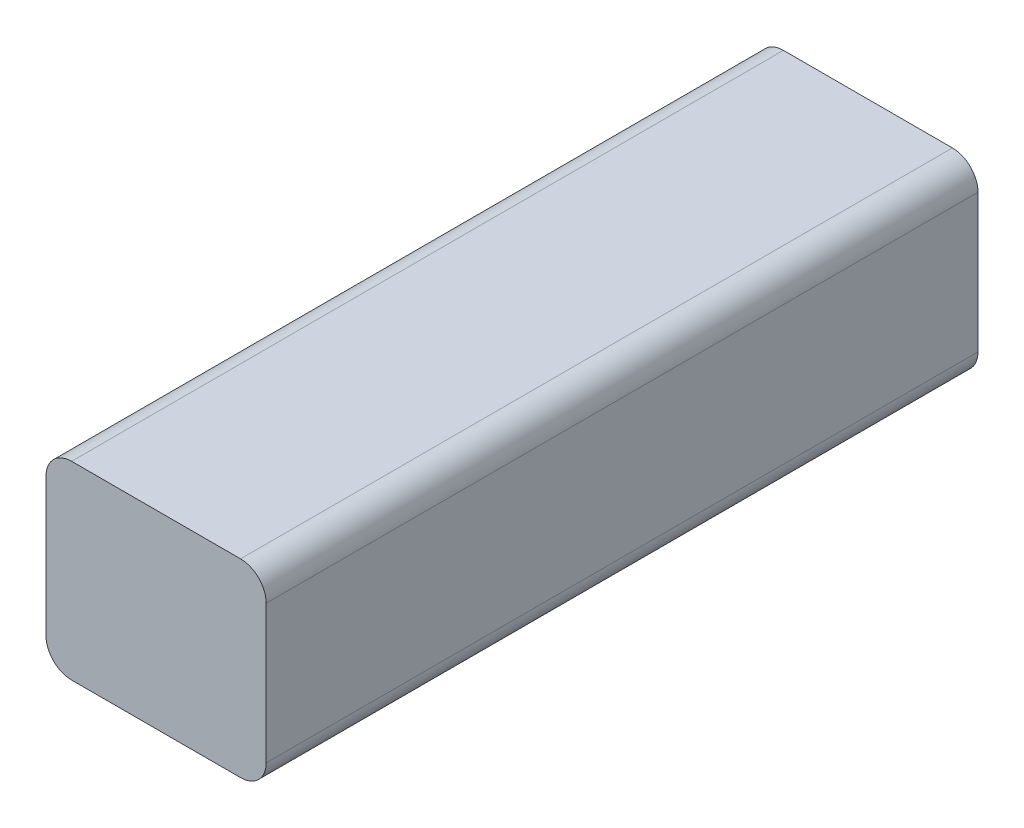
ISO-10303-21;
HEADER;
FILE_DESCRIPTION(('STEP AP214'),'2;1');
FILE_NAME('part.step','',(''),(''),'','','');
FILE_SCHEMA(('AUTOMOTIVE_DESIGN { 1 0 10303 214 1 1 1 1 }'));
ENDSEC;
DATA;
#1=APPLICATION_CONTEXT('core data for automotive mechanical design processes');
#2=APPLICATION_PROTOCOL_DEFINITION('international standard','automotive_design',2000,#1);
#3=PRODUCT_CONTEXT('',#1,'mechanical');
#4=PRODUCT('Part','Part','',(#3));
#5=PRODUCT_RELATED_PRODUCT_CATEGORY('part','',(#4));
#6=PRODUCT_DEFINITION_FORMATION('','',#4);
#7=PRODUCT_DEFINITION_CONTEXT('part definition',#1,'design');
#8=PRODUCT_DEFINITION('design','',#6,#7);
#9=PRODUCT_DEFINITION_SHAPE('','',#8);
#10=(LENGTH_UNIT() NAMED_UNIT(*) SI_UNIT(.MILLI.,.METRE.));
#11=(NAMED_UNIT(*) PLANE_ANGLE_UNIT() SI_UNIT($,.RADIAN.));
#12=(NAMED_UNIT(*) SI_UNIT($,.STERADIAN.) SOLID_ANGLE_UNIT());
#13=UNCERTAINTY_MEASURE_WITH_UNIT(LENGTH_MEASURE(1.E-05),#10,'distance_accuracy_value','');
#14=(GEOMETRIC_REPRESENTATION_CONTEXT(3) GLOBAL_UNCERTAINTY_ASSIGNED_CONTEXT((#13)) GLOBAL_UNIT_ASSIGNED_CONTEXT((#10,
#11,#12)) REPRESENTATION_CONTEXT('',''));
#15=CARTESIAN_POINT('',(0.,0.,0.));
#16=DIRECTION('',(0.,0.,1.));
#17=DIRECTION('',(1.,0.,0.));
#18=AXIS2_PLACEMENT_3D('',#15,#16,#17);
#19=CARTESIAN_POINT('',(-21.5,-18.5,139.));
#20=DIRECTION('',(1.,0.,0.));
#21=DIRECTION('',(0.,0.,-1.));
#22=AXIS2_PLACEMENT_3D('',#19,#20,#21);
#23=PLANE('',#22);
#24=DIRECTION('',(0.,-1.,0.));
#25=VECTOR('',#24,1.);
#26=CARTESIAN_POINT('',(-21.5,-18.5,0.));
#27=LINE('',#26,#25);
#28=CARTESIAN_POINT('',(-21.5,13.5,0.));
#29=VERTEX_POINT('',#28);
#30=CARTESIAN_POINT('',(-21.5,-13.5,0.));
#31=VERTEX_POINT('',#30);
#32=EDGE_CURVE('E134',#29,#31,#27,.T.);
#33=ORIENTED_EDGE('',*,*,#32,.T.);
#34=DIRECTION('',(0.,0.,-1.));
#35=VECTOR('',#34,1.);
#36=CARTESIAN_POINT('',(-21.5,-13.5,139.));
#37=LINE('',#36,#35);
#38=CARTESIAN_POINT('',(-21.5,-13.5,139.));
#39=VERTEX_POINT('',#38);
#40=EDGE_CURVE('E157',#31,#39,#37,.F.);
#41=ORIENTED_EDGE('',*,*,#40,.T.);
#42=DIRECTION('',(0.,-1.,0.));
#43=VECTOR('',#42,1.);
#44=CARTESIAN_POINT('',(-21.5,-18.5,139.));
#45=LINE('',#44,#43);
#46=CARTESIAN_POINT('',(-21.5,13.5,139.));
#47=VERTEX_POINT('',#46);
#48=EDGE_CURVE('E132',#47,#39,#45,.T.);
#49=ORIENTED_EDGE('',*,*,#48,.F.);
#50=DIRECTION('',(0.,0.,-1.));
#51=VECTOR('',#50,1.);
#52=CARTESIAN_POINT('',(-21.5,13.5,139.));
#53=LINE('',#52,#51);
#54=EDGE_CURVE('E154',#47,#29,#53,.T.);
#55=ORIENTED_EDGE('',*,*,#54,.T.);
#56=EDGE_LOOP('',(#33,#41,#49,#55));
#57=FACE_BOUND('',#56,.T.);
#58=ADVANCED_FACE('F39',(#57),#23,.F.);
#59=CARTESIAN_POINT('',(21.5,-18.5,139.));
#60=DIRECTION('',(0.,1.,0.));
#61=DIRECTION('',(-1.,0.,0.));
#62=AXIS2_PLACEMENT_3D('',#59,#60,#61);
#63=PLANE('',#62);
#64=DIRECTION('',(1.,0.,0.));
#65=VECTOR('',#64,1.);
#66=CARTESIAN_POINT('',(21.5,-18.5,0.));
#67=LINE('',#66,#65);
#68=CARTESIAN_POINT('',(-16.5,-18.5,0.));
#69=VERTEX_POINT('',#68);
#70=CARTESIAN_POINT('',(16.5,-18.5,0.));
#71=VERTEX_POINT('',#70);
#72=EDGE_CURVE('E130',#69,#71,#67,.T.);
#73=ORIENTED_EDGE('',*,*,#72,.T.);
#74=DIRECTION('',(0.,0.,-1.));
#75=VECTOR('',#74,1.);
#76=CARTESIAN_POINT('',(16.5,-18.5,139.));
#77=LINE('',#76,#75);
#78=CARTESIAN_POINT('',(16.5,-18.5,139.));
#79=VERTEX_POINT('',#78);
#80=EDGE_CURVE('E109',#71,#79,#77,.F.);
#81=ORIENTED_EDGE('',*,*,#80,.T.);
#82=DIRECTION('',(1.,0.,0.));
#83=VECTOR('',#82,1.);
#84=CARTESIAN_POINT('',(21.5,-18.5,139.));
#85=LINE('',#84,#83);
#86=CARTESIAN_POINT('',(-16.5,-18.5,139.));
#87=VERTEX_POINT('',#86);
#88=EDGE_CURVE('E173',#87,#79,#85,.T.);
#89=ORIENTED_EDGE('',*,*,#88,.F.);
#90=DIRECTION('',(0.,0.,-1.));
#91=VECTOR('',#90,1.);
#92=CARTESIAN_POINT('',(-16.5,-18.5,139.));
#93=LINE('',#92,#91);
#94=EDGE_CURVE('E114',#87,#69,#93,.T.);
#95=ORIENTED_EDGE('',*,*,#94,.T.);
#96=EDGE_LOOP('',(#73,#81,#89,#95));
#97=FACE_BOUND('',#96,.T.);
#98=ADVANCED_FACE('F190',(#97),#63,.F.);
#99=CARTESIAN_POINT('',(21.5,-18.5,139.));
#100=DIRECTION('',(-1.,0.,0.));
#101=DIRECTION('',(0.,0.,1.));
#102=AXIS2_PLACEMENT_3D('',#99,#100,#101);
#103=PLANE('',#102);
#104=DIRECTION('',(0.,1.,0.));
#105=VECTOR('',#104,1.);
#106=CARTESIAN_POINT('',(21.5,-18.5,139.));
#107=LINE('',#106,#105);
#108=CARTESIAN_POINT('',(21.5,-13.5,139.));
#109=VERTEX_POINT('',#108);
#110=CARTESIAN_POINT('',(21.5,13.5,139.));
#111=VERTEX_POINT('',#110);
#112=EDGE_CURVE('E123',#109,#111,#107,.T.);
#113=ORIENTED_EDGE('',*,*,#112,.F.);
#114=DIRECTION('',(0.,0.,-1.));
#115=VECTOR('',#114,1.);
#116=CARTESIAN_POINT('',(21.5,-13.5,139.));
#117=LINE('',#116,#115);
#118=CARTESIAN_POINT('',(21.5,-13.5,0.));
#119=VERTEX_POINT('',#118);
#120=EDGE_CURVE('E108',#109,#119,#117,.T.);
#121=ORIENTED_EDGE('',*,*,#120,.T.);
#122=DIRECTION('',(0.,1.,0.));
#123=VECTOR('',#122,1.);
#124=CARTESIAN_POINT('',(21.5,-18.5,0.));
#125=LINE('',#124,#123);
#126=CARTESIAN_POINT('',(21.5,13.5,0.));
#127=VERTEX_POINT('',#126);
#128=EDGE_CURVE('E121',#119,#127,#125,.T.);
#129=ORIENTED_EDGE('',*,*,#128,.T.);
#130=DIRECTION('',(0.,0.,-1.));
#131=VECTOR('',#130,1.);
#132=CARTESIAN_POINT('',(21.5,13.5,139.));
#133=LINE('',#132,#131);
#134=EDGE_CURVE('E125',#127,#111,#133,.F.);
#135=ORIENTED_EDGE('',*,*,#134,.T.);
#136=EDGE_LOOP('',(#113,#121,#129,#135));
#137=FACE_BOUND('',#136,.T.);
#138=ADVANCED_FACE('F120',(#137),#103,.F.);
#139=CARTESIAN_POINT('',(21.5,18.5,139.));
#140=DIRECTION('',(0.,-1.,0.));
#141=DIRECTION('',(1.,0.,0.));
#142=AXIS2_PLACEMENT_3D('',#139,#140,#141);
#143=PLANE('',#142);
#144=DIRECTION('',(-1.,0.,0.));
#145=VECTOR('',#144,1.);
#146=CARTESIAN_POINT('',(21.5,18.5,0.));
#147=LINE('',#146,#145);
#148=CARTESIAN_POINT('',(16.5,18.5,0.));
#149=VERTEX_POINT('',#148);
#150=CARTESIAN_POINT('',(-16.5,18.5,0.));
#151=VERTEX_POINT('',#150);
#152=EDGE_CURVE('E129',#149,#151,#147,.T.);
#153=ORIENTED_EDGE('',*,*,#152,.T.);
#154=DIRECTION('',(0.,0.,-1.));
#155=VECTOR('',#154,1.);
#156=CARTESIAN_POINT('',(-16.5,18.5,139.));
#157=LINE('',#156,#155);
#158=CARTESIAN_POINT('',(-16.5,18.5,139.));
#159=VERTEX_POINT('',#158);
#160=EDGE_CURVE('E11',#151,#159,#157,.F.);
#161=ORIENTED_EDGE('',*,*,#160,.T.);
#162=DIRECTION('',(-1.,0.,0.));
#163=VECTOR('',#162,1.);
#164=CARTESIAN_POINT('',(21.5,18.5,139.));
#165=LINE('',#164,#163);
#166=CARTESIAN_POINT('',(16.5,18.5,139.));
#167=VERTEX_POINT('',#166);
#168=EDGE_CURVE('E138',#167,#159,#165,.T.);
#169=ORIENTED_EDGE('',*,*,#168,.F.);
#170=DIRECTION('',(0.,0.,-1.));
#171=VECTOR('',#170,1.);
#172=CARTESIAN_POINT('',(16.5,18.5,139.));
#173=LINE('',#172,#171);
#174=EDGE_CURVE('E47',#167,#149,#173,.T.);
#175=ORIENTED_EDGE('',*,*,#174,.T.);
#176=EDGE_LOOP('',(#153,#161,#169,#175));
#177=FACE_BOUND('',#176,.T.);
#178=ADVANCED_FACE('F160',(#177),#143,.F.);
#179=CARTESIAN_POINT('',(0.,0.,139.));
#180=DIRECTION('',(0.,0.,1.));
#181=DIRECTION('',(1.,0.,0.));
#182=AXIS2_PLACEMENT_3D('',#179,#180,#181);
#183=PLANE('',#182);
#184=ORIENTED_EDGE('',*,*,#88,.T.);
#185=CARTESIAN_POINT('',(16.5,-13.5,139.));
#186=DIRECTION('',(0.,0.,1.));
#187=DIRECTION('',(1.,0.,0.));
#188=AXIS2_PLACEMENT_3D('',#185,#186,#187);
#189=CIRCLE('',#188,5.);
#190=EDGE_CURVE('E152',#79,#109,#189,.T.);
#191=ORIENTED_EDGE('',*,*,#190,.T.);
#192=ORIENTED_EDGE('',*,*,#112,.T.);
#193=CARTESIAN_POINT('',(16.5,13.5,139.));
#194=DIRECTION('',(0.,0.,1.));
#195=DIRECTION('',(1.,0.,0.));
#196=AXIS2_PLACEMENT_3D('',#193,#194,#195);
#197=CIRCLE('',#196,5.);
#198=EDGE_CURVE('E59',#111,#167,#197,.T.);
#199=ORIENTED_EDGE('',*,*,#198,.T.);
#200=ORIENTED_EDGE('',*,*,#168,.T.);
#201=CARTESIAN_POINT('',(-16.5,13.5,139.));
#202=DIRECTION('',(0.,0.,1.));
#203=DIRECTION('',(1.,0.,0.));
#204=AXIS2_PLACEMENT_3D('',#201,#202,#203);
#205=CIRCLE('',#204,5.);
#206=EDGE_CURVE('E148',#159,#47,#205,.T.);
#207=ORIENTED_EDGE('',*,*,#206,.T.);
#208=ORIENTED_EDGE('',*,*,#48,.T.);
#209=CARTESIAN_POINT('',(-16.5,-13.5,139.));
#210=DIRECTION('',(0.,0.,1.));
#211=DIRECTION('',(1.,0.,0.));
#212=AXIS2_PLACEMENT_3D('',#209,#210,#211);
#213=CIRCLE('',#212,5.);
#214=EDGE_CURVE('E150',#39,#87,#213,.T.);
#215=ORIENTED_EDGE('',*,*,#214,.T.);
#216=EDGE_LOOP('',(#184,#191,#192,#199,#200,#207,#208,#215));
#217=FACE_BOUND('',#216,.T.);
#218=ADVANCED_FACE('F179',(#217),#183,.T.);
#219=CARTESIAN_POINT('',(0.,0.,0.));
#220=DIRECTION('',(0.,0.,1.));
#221=DIRECTION('',(1.,0.,0.));
#222=AXIS2_PLACEMENT_3D('',#219,#220,#221);
#223=PLANE('',#222);
#224=ORIENTED_EDGE('',*,*,#128,.F.);
#225=CARTESIAN_POINT('',(16.5,-13.5,0.));
#226=DIRECTION('',(0.,0.,1.));
#227=DIRECTION('',(1.,0.,0.));
#228=AXIS2_PLACEMENT_3D('',#225,#226,#227);
#229=CIRCLE('',#228,5.);
#230=EDGE_CURVE('E104',#119,#71,#229,.F.);
#231=ORIENTED_EDGE('',*,*,#230,.T.);
#232=ORIENTED_EDGE('',*,*,#72,.F.);
#233=CARTESIAN_POINT('',(-16.5,-13.5,0.));
#234=DIRECTION('',(0.,0.,1.));
#235=DIRECTION('',(1.,0.,0.));
#236=AXIS2_PLACEMENT_3D('',#233,#234,#235);
#237=CIRCLE('',#236,5.);
#238=EDGE_CURVE('E115',#69,#31,#237,.F.);
#239=ORIENTED_EDGE('',*,*,#238,.T.);
#240=ORIENTED_EDGE('',*,*,#32,.F.);
#241=CARTESIAN_POINT('',(-16.5,13.5,0.));
#242=DIRECTION('',(0.,0.,1.));
#243=DIRECTION('',(1.,0.,0.));
#244=AXIS2_PLACEMENT_3D('',#241,#242,#243);
#245=CIRCLE('',#244,5.);
#246=EDGE_CURVE('E141',#29,#151,#245,.F.);
#247=ORIENTED_EDGE('',*,*,#246,.T.);
#248=ORIENTED_EDGE('',*,*,#152,.F.);
#249=CARTESIAN_POINT('',(16.5,13.5,0.));
#250=DIRECTION('',(0.,0.,1.));
#251=DIRECTION('',(1.,0.,0.));
#252=AXIS2_PLACEMENT_3D('',#249,#250,#251);
#253=CIRCLE('',#252,5.);
#254=EDGE_CURVE('E124',#149,#127,#253,.F.);
#255=ORIENTED_EDGE('',*,*,#254,.T.);
#256=EDGE_LOOP('',(#224,#231,#232,#239,#240,#247,#248,#255));
#257=FACE_BOUND('',#256,.T.);
#258=ADVANCED_FACE('F127',(#257),#223,.F.);
#259=CARTESIAN_POINT('',(16.5,-13.5,139.));
#260=DIRECTION('',(0.,0.,-1.));
#261=DIRECTION('',(-1.,0.,0.));
#262=AXIS2_PLACEMENT_3D('',#259,#260,#261);
#263=CYLINDRICAL_SURFACE('',#262,5.);
#264=ORIENTED_EDGE('',*,*,#190,.F.);
#265=ORIENTED_EDGE('',*,*,#80,.F.);
#266=ORIENTED_EDGE('',*,*,#230,.F.);
#267=ORIENTED_EDGE('',*,*,#120,.F.);
#268=EDGE_LOOP('',(#264,#265,#266,#267));
#269=FACE_BOUND('',#268,.T.);
#270=ADVANCED_FACE('F107',(#269),#263,.T.);
#271=CARTESIAN_POINT('',(-16.5,-13.5,139.));
#272=DIRECTION('',(0.,0.,-1.));
#273=DIRECTION('',(-1.,0.,0.));
#274=AXIS2_PLACEMENT_3D('',#271,#272,#273);
#275=CYLINDRICAL_SURFACE('',#274,5.);
#276=ORIENTED_EDGE('',*,*,#214,.F.);
#277=ORIENTED_EDGE('',*,*,#40,.F.);
#278=ORIENTED_EDGE('',*,*,#238,.F.);
#279=ORIENTED_EDGE('',*,*,#94,.F.);
#280=EDGE_LOOP('',(#276,#277,#278,#279));
#281=FACE_BOUND('',#280,.T.);
#282=ADVANCED_FACE('F201',(#281),#275,.T.);
#283=CARTESIAN_POINT('',(-16.5,13.5,139.));
#284=DIRECTION('',(0.,0.,-1.));
#285=DIRECTION('',(-1.,0.,0.));
#286=AXIS2_PLACEMENT_3D('',#283,#284,#285);
#287=CYLINDRICAL_SURFACE('',#286,5.);
#288=ORIENTED_EDGE('',*,*,#206,.F.);
#289=ORIENTED_EDGE('',*,*,#160,.F.);
#290=ORIENTED_EDGE('',*,*,#246,.F.);
#291=ORIENTED_EDGE('',*,*,#54,.F.);
#292=EDGE_LOOP('',(#288,#289,#290,#291));
#293=FACE_BOUND('',#292,.T.);
#294=ADVANCED_FACE('F167',(#293),#287,.T.);
#295=CARTESIAN_POINT('',(16.5,13.5,139.));
#296=DIRECTION('',(0.,0.,-1.));
#297=DIRECTION('',(-1.,0.,0.));
#298=AXIS2_PLACEMENT_3D('',#295,#296,#297);
#299=CYLINDRICAL_SURFACE('',#298,5.);
#300=ORIENTED_EDGE('',*,*,#198,.F.);
#301=ORIENTED_EDGE('',*,*,#134,.F.);
#302=ORIENTED_EDGE('',*,*,#254,.F.);
#303=ORIENTED_EDGE('',*,*,#174,.F.);
#304=EDGE_LOOP('',(#300,#301,#302,#303));
#305=FACE_BOUND('',#304,.T.);
#306=ADVANCED_FACE('F41',(#305),#299,.T.);
#307=CLOSED_SHELL('',(#58,#98,#138,#178,#218,#258,#270,#282,#294,#306));
#308=MANIFOLD_SOLID_BREP('B2',#307);
#309=ADVANCED_BREP_SHAPE_REPRESENTATION('',(#18,#308),#14);
#310=SHAPE_DEFINITION_REPRESENTATION(#9,#309);
ENDSEC;
END-ISO-10303-21;
